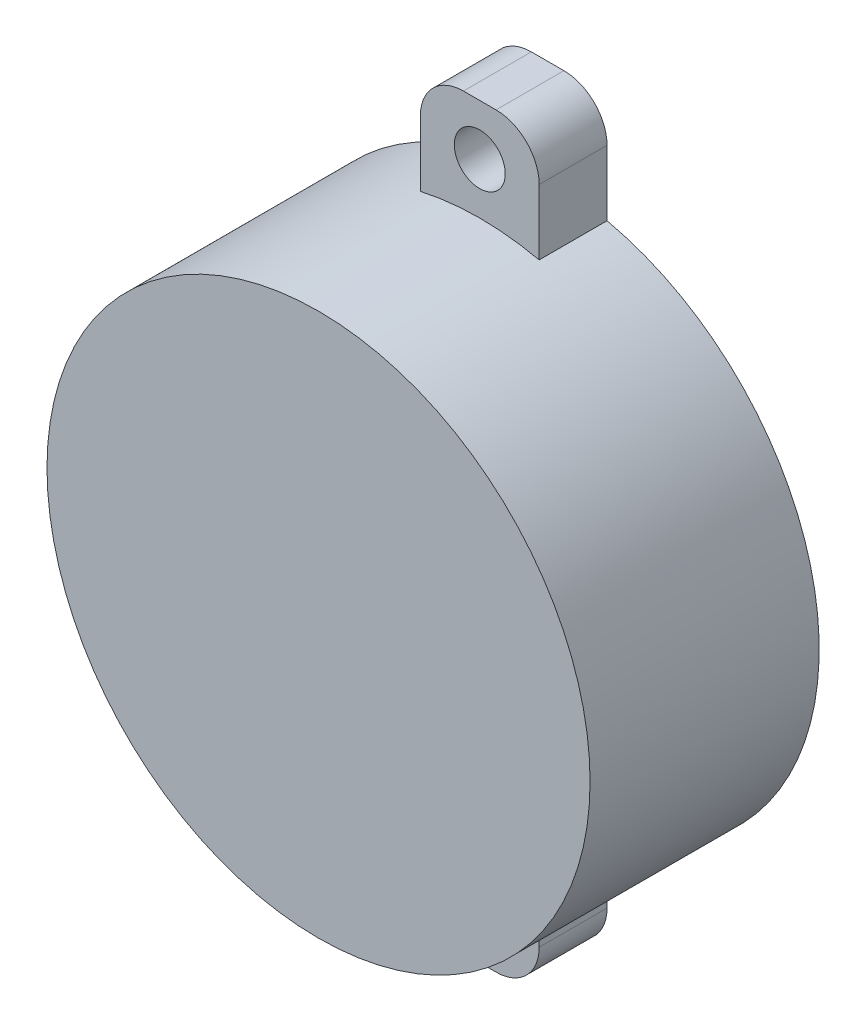
ISO-10303-21;
HEADER;
FILE_DESCRIPTION(('STEP AP214'),'2;1');
FILE_NAME('part.step','',(''),(''),'','','');
FILE_SCHEMA(('AUTOMOTIVE_DESIGN { 1 0 10303 214 1 1 1 1 }'));
ENDSEC;
DATA;
#1=APPLICATION_CONTEXT('core data for automotive mechanical design processes');
#2=APPLICATION_PROTOCOL_DEFINITION('international standard','automotive_design',2000,#1);
#3=PRODUCT_CONTEXT('',#1,'mechanical');
#4=PRODUCT('Part','Part','',(#3));
#5=PRODUCT_RELATED_PRODUCT_CATEGORY('part','',(#4));
#6=PRODUCT_DEFINITION_FORMATION('','',#4);
#7=PRODUCT_DEFINITION_CONTEXT('part definition',#1,'design');
#8=PRODUCT_DEFINITION('design','',#6,#7);
#9=PRODUCT_DEFINITION_SHAPE('','',#8);
#10=(LENGTH_UNIT() NAMED_UNIT(*) SI_UNIT(.MILLI.,.METRE.));
#11=(NAMED_UNIT(*) PLANE_ANGLE_UNIT() SI_UNIT($,.RADIAN.));
#12=(NAMED_UNIT(*) SI_UNIT($,.STERADIAN.) SOLID_ANGLE_UNIT());
#13=UNCERTAINTY_MEASURE_WITH_UNIT(LENGTH_MEASURE(1.E-05),#10,'distance_accuracy_value','');
#14=(GEOMETRIC_REPRESENTATION_CONTEXT(3) GLOBAL_UNCERTAINTY_ASSIGNED_CONTEXT((#13)) GLOBAL_UNIT_ASSIGNED_CONTEXT((#10,
#11,#12)) REPRESENTATION_CONTEXT('',''));
#15=CARTESIAN_POINT('',(0.,0.,0.));
#16=DIRECTION('',(0.,0.,1.));
#17=DIRECTION('',(1.,0.,0.));
#18=AXIS2_PLACEMENT_3D('',#15,#16,#17);
#19=CARTESIAN_POINT('',(0.,0.,0.));
#20=DIRECTION('',(0.,0.,1.));
#21=DIRECTION('',(1.,0.,0.));
#22=AXIS2_PLACEMENT_3D('',#19,#20,#21);
#23=PLANE('',#22);
#24=DIRECTION('',(1.,0.,0.));
#25=VECTOR('',#24,1.);
#26=CARTESIAN_POINT('',(3.5,22.,0.));
#27=LINE('',#26,#25);
#28=CARTESIAN_POINT('',(-0.959999999999997,22.,0.));
#29=VERTEX_POINT('',#28);
#30=CARTESIAN_POINT('',(0.960000000000003,22.,0.));
#31=VERTEX_POINT('',#30);
#32=EDGE_CURVE('E166',#29,#31,#27,.T.);
#33=ORIENTED_EDGE('',*,*,#32,.T.);
#34=CARTESIAN_POINT('',(0.960000000000003,19.46,0.));
#35=DIRECTION('',(0.,0.,1.));
#36=DIRECTION('',(1.,0.,0.));
#37=AXIS2_PLACEMENT_3D('',#34,#35,#36);
#38=CIRCLE('',#37,2.54);
#39=CARTESIAN_POINT('',(3.5,19.46,0.));
#40=VERTEX_POINT('',#39);
#41=EDGE_CURVE('E201',#31,#40,#38,.F.);
#42=ORIENTED_EDGE('',*,*,#41,.T.);
#43=DIRECTION('',(0.,-1.,0.));
#44=VECTOR('',#43,1.);
#45=CARTESIAN_POINT('',(3.5,22.,0.));
#46=LINE('',#45,#44);
#47=CARTESIAN_POINT('',(3.5,15.612494995996,0.));
#48=VERTEX_POINT('',#47);
#49=EDGE_CURVE('E141',#40,#48,#46,.T.);
#50=ORIENTED_EDGE('',*,*,#49,.T.);
#51=CARTESIAN_POINT('',(0.,0.,0.));
#52=DIRECTION('',(0.,0.,1.));
#53=DIRECTION('',(1.,0.,0.));
#54=AXIS2_PLACEMENT_3D('',#51,#52,#53);
#55=CIRCLE('',#54,16.);
#56=CARTESIAN_POINT('',(3.5,-15.612494995996,0.));
#57=VERTEX_POINT('',#56);
#58=EDGE_CURVE('E134',#57,#48,#55,.T.);
#59=ORIENTED_EDGE('',*,*,#58,.F.);
#60=CARTESIAN_POINT('',(3.5,-19.46,0.));
#61=VERTEX_POINT('',#60);
#62=EDGE_CURVE('E139',#57,#61,#46,.T.);
#63=ORIENTED_EDGE('',*,*,#62,.T.);
#64=CARTESIAN_POINT('',(0.959999999999998,-19.46,0.));
#65=DIRECTION('',(0.,0.,1.));
#66=DIRECTION('',(1.,0.,0.));
#67=AXIS2_PLACEMENT_3D('',#64,#65,#66);
#68=CIRCLE('',#67,2.54);
#69=CARTESIAN_POINT('',(0.959999999999998,-22.,0.));
#70=VERTEX_POINT('',#69);
#71=EDGE_CURVE('E197',#61,#70,#68,.F.);
#72=ORIENTED_EDGE('',*,*,#71,.T.);
#73=DIRECTION('',(-1.,0.,0.));
#74=VECTOR('',#73,1.);
#75=CARTESIAN_POINT('',(3.5,-22.,0.));
#76=LINE('',#75,#74);
#77=CARTESIAN_POINT('',(-0.960000000000003,-22.,0.));
#78=VERTEX_POINT('',#77);
#79=EDGE_CURVE('E168',#70,#78,#76,.T.);
#80=ORIENTED_EDGE('',*,*,#79,.T.);
#81=CARTESIAN_POINT('',(-0.960000000000003,-19.46,0.));
#82=DIRECTION('',(0.,0.,1.));
#83=DIRECTION('',(1.,0.,0.));
#84=AXIS2_PLACEMENT_3D('',#81,#82,#83);
#85=CIRCLE('',#84,2.54);
#86=CARTESIAN_POINT('',(-3.5,-19.46,0.));
#87=VERTEX_POINT('',#86);
#88=EDGE_CURVE('E194',#78,#87,#85,.F.);
#89=ORIENTED_EDGE('',*,*,#88,.T.);
#90=DIRECTION('',(0.,1.,0.));
#91=VECTOR('',#90,1.);
#92=CARTESIAN_POINT('',(-3.5,22.,0.));
#93=LINE('',#92,#91);
#94=CARTESIAN_POINT('',(-3.5,-15.612494995996,0.));
#95=VERTEX_POINT('',#94);
#96=EDGE_CURVE('E169',#87,#95,#93,.T.);
#97=ORIENTED_EDGE('',*,*,#96,.T.);
#98=CARTESIAN_POINT('',(-3.5,15.612494995996,0.));
#99=VERTEX_POINT('',#98);
#100=EDGE_CURVE('E146',#99,#95,#55,.T.);
#101=ORIENTED_EDGE('',*,*,#100,.F.);
#102=CARTESIAN_POINT('',(-3.5,19.46,0.));
#103=VERTEX_POINT('',#102);
#104=EDGE_CURVE('E223',#99,#103,#93,.T.);
#105=ORIENTED_EDGE('',*,*,#104,.T.);
#106=CARTESIAN_POINT('',(-0.959999999999997,19.46,0.));
#107=DIRECTION('',(0.,0.,1.));
#108=DIRECTION('',(1.,0.,0.));
#109=AXIS2_PLACEMENT_3D('',#106,#107,#108);
#110=CIRCLE('',#109,2.54);
#111=EDGE_CURVE('E199',#103,#29,#110,.F.);
#112=ORIENTED_EDGE('',*,*,#111,.T.);
#113=EDGE_LOOP('',(#33,#42,#50,#59,#63,#72,#80,#89,#97,#101,#105,#112));
#114=FACE_BOUND('',#113,.T.);
#115=CARTESIAN_POINT('',(0.,-19.,0.));
#116=DIRECTION('',(0.,0.,-1.));
#117=DIRECTION('',(-1.,0.,0.));
#118=AXIS2_PLACEMENT_3D('',#115,#116,#117);
#119=CIRCLE('',#118,1.5);
#120=CARTESIAN_POINT('',(-1.5,-19.,0.));
#121=VERTEX_POINT('',#120);
#122=EDGE_CURVE('E224',#121,#121,#119,.T.);
#123=ORIENTED_EDGE('',*,*,#122,.F.);
#124=EDGE_LOOP('',(#123));
#125=FACE_BOUND('',#124,.T.);
#126=CARTESIAN_POINT('',(0.,19.,0.));
#127=DIRECTION('',(0.,0.,1.));
#128=DIRECTION('',(-1.,0.,0.));
#129=AXIS2_PLACEMENT_3D('',#126,#127,#128);
#130=CIRCLE('',#129,1.5);
#131=CARTESIAN_POINT('',(-1.5,19.,0.));
#132=VERTEX_POINT('',#131);
#133=EDGE_CURVE('E235',#132,#132,#130,.T.);
#134=ORIENTED_EDGE('',*,*,#133,.T.);
#135=EDGE_LOOP('',(#134));
#136=FACE_BOUND('',#135,.T.);
#137=ADVANCED_FACE('F38',(#114,#125,#136),#23,.F.);
#138=CARTESIAN_POINT('',(0.,0.,4.));
#139=DIRECTION('',(0.,0.,-1.));
#140=DIRECTION('',(-1.,0.,0.));
#141=AXIS2_PLACEMENT_3D('',#138,#139,#140);
#142=PLANE('',#141);
#143=DIRECTION('',(0.,-1.,0.));
#144=VECTOR('',#143,1.);
#145=CARTESIAN_POINT('',(3.5,22.,4.));
#146=LINE('',#145,#144);
#147=CARTESIAN_POINT('',(3.5,19.46,4.));
#148=VERTEX_POINT('',#147);
#149=CARTESIAN_POINT('',(3.5,15.612494995996,4.));
#150=VERTEX_POINT('',#149);
#151=EDGE_CURVE('E244',#148,#150,#146,.T.);
#152=ORIENTED_EDGE('',*,*,#151,.F.);
#153=CARTESIAN_POINT('',(0.960000000000003,19.46,4.));
#154=DIRECTION('',(0.,0.,-1.));
#155=DIRECTION('',(-1.,0.,0.));
#156=AXIS2_PLACEMENT_3D('',#153,#154,#155);
#157=CIRCLE('',#156,2.54);
#158=CARTESIAN_POINT('',(0.960000000000003,22.,4.));
#159=VERTEX_POINT('',#158);
#160=EDGE_CURVE('E207',#148,#159,#157,.F.);
#161=ORIENTED_EDGE('',*,*,#160,.T.);
#162=DIRECTION('',(1.,0.,0.));
#163=VECTOR('',#162,1.);
#164=CARTESIAN_POINT('',(3.5,22.,4.));
#165=LINE('',#164,#163);
#166=CARTESIAN_POINT('',(-0.959999999999997,22.,4.));
#167=VERTEX_POINT('',#166);
#168=EDGE_CURVE('E240',#167,#159,#165,.T.);
#169=ORIENTED_EDGE('',*,*,#168,.F.);
#170=CARTESIAN_POINT('',(-0.959999999999997,19.46,4.));
#171=DIRECTION('',(0.,0.,-1.));
#172=DIRECTION('',(-1.,0.,0.));
#173=AXIS2_PLACEMENT_3D('',#170,#171,#172);
#174=CIRCLE('',#173,2.54);
#175=CARTESIAN_POINT('',(-3.5,19.46,4.));
#176=VERTEX_POINT('',#175);
#177=EDGE_CURVE('E205',#167,#176,#174,.F.);
#178=ORIENTED_EDGE('',*,*,#177,.T.);
#179=DIRECTION('',(0.,1.,0.));
#180=VECTOR('',#179,1.);
#181=CARTESIAN_POINT('',(-3.5,22.,4.));
#182=LINE('',#181,#180);
#183=CARTESIAN_POINT('',(-3.5,15.612494995996,4.));
#184=VERTEX_POINT('',#183);
#185=EDGE_CURVE('E175',#184,#176,#182,.T.);
#186=ORIENTED_EDGE('',*,*,#185,.F.);
#187=CARTESIAN_POINT('',(0.,0.,4.));
#188=DIRECTION('',(0.,0.,-1.));
#189=DIRECTION('',(-1.,0.,0.));
#190=AXIS2_PLACEMENT_3D('',#187,#188,#189);
#191=CIRCLE('',#190,16.);
#192=EDGE_CURVE('E188',#184,#150,#191,.T.);
#193=ORIENTED_EDGE('',*,*,#192,.T.);
#194=EDGE_LOOP('',(#152,#161,#169,#178,#186,#193));
#195=FACE_BOUND('',#194,.T.);
#196=CARTESIAN_POINT('',(0.,19.,4.));
#197=DIRECTION('',(0.,0.,-1.));
#198=DIRECTION('',(-1.,0.,0.));
#199=AXIS2_PLACEMENT_3D('',#196,#197,#198);
#200=CIRCLE('',#199,1.5);
#201=CARTESIAN_POINT('',(-1.5,19.,4.));
#202=VERTEX_POINT('',#201);
#203=EDGE_CURVE('E42',#202,#202,#200,.F.);
#204=ORIENTED_EDGE('',*,*,#203,.F.);
#205=EDGE_LOOP('',(#204));
#206=FACE_BOUND('',#205,.T.);
#207=ADVANCED_FACE('F274',(#195,#206),#142,.F.);
#208=CARTESIAN_POINT('',(0.,0.,13.5));
#209=DIRECTION('',(0.,0.,-1.));
#210=DIRECTION('',(-1.,0.,0.));
#211=AXIS2_PLACEMENT_3D('',#208,#209,#210);
#212=CYLINDRICAL_SURFACE('',#211,16.);
#213=ORIENTED_EDGE('',*,*,#192,.F.);
#214=DIRECTION('',(0.,0.,-1.));
#215=VECTOR('',#214,1.);
#216=CARTESIAN_POINT('',(-3.5,15.612494995996,13.5));
#217=LINE('',#216,#215);
#218=EDGE_CURVE('E147',#184,#99,#217,.T.);
#219=ORIENTED_EDGE('',*,*,#218,.T.);
#220=ORIENTED_EDGE('',*,*,#100,.T.);
#221=DIRECTION('',(0.,0.,-1.));
#222=VECTOR('',#221,1.);
#223=CARTESIAN_POINT('',(-3.5,-15.612494995996,13.5));
#224=LINE('',#223,#222);
#225=CARTESIAN_POINT('',(-3.5,-15.612494995996,4.));
#226=VERTEX_POINT('',#225);
#227=EDGE_CURVE('E159',#95,#226,#224,.F.);
#228=ORIENTED_EDGE('',*,*,#227,.T.);
#229=CARTESIAN_POINT('',(3.5,-15.612494995996,4.));
#230=VERTEX_POINT('',#229);
#231=EDGE_CURVE('E155',#230,#226,#191,.T.);
#232=ORIENTED_EDGE('',*,*,#231,.F.);
#233=DIRECTION('',(0.,0.,-1.));
#234=VECTOR('',#233,1.);
#235=CARTESIAN_POINT('',(3.5,-15.612494995996,13.5));
#236=LINE('',#235,#234);
#237=EDGE_CURVE('E150',#230,#57,#236,.T.);
#238=ORIENTED_EDGE('',*,*,#237,.T.);
#239=ORIENTED_EDGE('',*,*,#58,.T.);
#240=DIRECTION('',(0.,0.,-1.));
#241=VECTOR('',#240,1.);
#242=CARTESIAN_POINT('',(3.5,15.612494995996,13.5));
#243=LINE('',#242,#241);
#244=EDGE_CURVE('E160',#48,#150,#243,.F.);
#245=ORIENTED_EDGE('',*,*,#244,.T.);
#246=EDGE_LOOP('',(#213,#219,#220,#228,#232,#238,#239,#245));
#247=FACE_BOUND('',#246,.T.);
#248=CARTESIAN_POINT('',(0.,0.,13.5));
#249=DIRECTION('',(0.,0.,1.));
#250=DIRECTION('',(1.,0.,0.));
#251=AXIS2_PLACEMENT_3D('',#248,#249,#250);
#252=CIRCLE('',#251,16.);
#253=CARTESIAN_POINT('',(16.,0.,13.5));
#254=VERTEX_POINT('',#253);
#255=EDGE_CURVE('E182',#254,#254,#252,.T.);
#256=ORIENTED_EDGE('',*,*,#255,.F.);
#257=EDGE_LOOP('',(#256));
#258=FACE_BOUND('',#257,.T.);
#259=ADVANCED_FACE('F151',(#247,#258),#212,.T.);
#260=CARTESIAN_POINT('',(0.,0.,13.5));
#261=DIRECTION('',(0.,0.,1.));
#262=DIRECTION('',(1.,0.,0.));
#263=AXIS2_PLACEMENT_3D('',#260,#261,#262);
#264=PLANE('',#263);
#265=ORIENTED_EDGE('',*,*,#255,.T.);
#266=EDGE_LOOP('',(#265));
#267=FACE_BOUND('',#266,.T.);
#268=ADVANCED_FACE('F284',(#267),#264,.T.);
#269=CARTESIAN_POINT('',(3.5,-22.,4.));
#270=DIRECTION('',(0.,-1.,0.));
#271=DIRECTION('',(0.,0.,-1.));
#272=AXIS2_PLACEMENT_3D('',#269,#270,#271);
#273=PLANE('',#272);
#274=ORIENTED_EDGE('',*,*,#79,.F.);
#275=DIRECTION('',(0.,0.,-1.));
#276=VECTOR('',#275,1.);
#277=CARTESIAN_POINT('',(0.959999999999998,-22.,4.));
#278=LINE('',#277,#276);
#279=CARTESIAN_POINT('',(0.959999999999998,-22.,4.));
#280=VERTEX_POINT('',#279);
#281=EDGE_CURVE('E216',#70,#280,#278,.F.);
#282=ORIENTED_EDGE('',*,*,#281,.T.);
#283=DIRECTION('',(-1.,0.,0.));
#284=VECTOR('',#283,1.);
#285=CARTESIAN_POINT('',(3.5,-22.,4.));
#286=LINE('',#285,#284);
#287=CARTESIAN_POINT('',(-0.960000000000003,-22.,4.));
#288=VERTEX_POINT('',#287);
#289=EDGE_CURVE('E176',#280,#288,#286,.T.);
#290=ORIENTED_EDGE('',*,*,#289,.T.);
#291=DIRECTION('',(0.,0.,-1.));
#292=VECTOR('',#291,1.);
#293=CARTESIAN_POINT('',(-0.960000000000003,-22.,4.));
#294=LINE('',#293,#292);
#295=EDGE_CURVE('E213',#288,#78,#294,.T.);
#296=ORIENTED_EDGE('',*,*,#295,.T.);
#297=EDGE_LOOP('',(#274,#282,#290,#296));
#298=FACE_BOUND('',#297,.T.);
#299=ADVANCED_FACE('F258',(#298),#273,.T.);
#300=CARTESIAN_POINT('',(0.,-19.,4.));
#301=DIRECTION('',(0.,0.,-1.));
#302=DIRECTION('',(-1.,0.,0.));
#303=AXIS2_PLACEMENT_3D('',#300,#301,#302);
#304=CIRCLE('',#303,1.5);
#305=CARTESIAN_POINT('',(-1.5,-19.,4.));
#306=VERTEX_POINT('',#305);
#307=EDGE_CURVE('E220',#306,#306,#304,.T.);
#308=ORIENTED_EDGE('',*,*,#307,.T.);
#309=EDGE_LOOP('',(#308));
#310=FACE_BOUND('',#309,.T.);
#311=ORIENTED_EDGE('',*,*,#289,.F.);
#312=CARTESIAN_POINT('',(0.959999999999998,-19.46,4.));
#313=DIRECTION('',(0.,0.,-1.));
#314=DIRECTION('',(-1.,0.,0.));
#315=AXIS2_PLACEMENT_3D('',#312,#313,#314);
#316=CIRCLE('',#315,2.54);
#317=CARTESIAN_POINT('',(3.5,-19.46,4.));
#318=VERTEX_POINT('',#317);
#319=EDGE_CURVE('E48',#280,#318,#316,.F.);
#320=ORIENTED_EDGE('',*,*,#319,.T.);
#321=EDGE_CURVE('E243',#230,#318,#146,.T.);
#322=ORIENTED_EDGE('',*,*,#321,.F.);
#323=ORIENTED_EDGE('',*,*,#231,.T.);
#324=CARTESIAN_POINT('',(-3.5,-19.46,4.));
#325=VERTEX_POINT('',#324);
#326=EDGE_CURVE('E238',#325,#226,#182,.T.);
#327=ORIENTED_EDGE('',*,*,#326,.F.);
#328=CARTESIAN_POINT('',(-0.960000000000003,-19.46,4.));
#329=DIRECTION('',(0.,0.,-1.));
#330=DIRECTION('',(-1.,0.,0.));
#331=AXIS2_PLACEMENT_3D('',#328,#329,#330);
#332=CIRCLE('',#331,2.54);
#333=EDGE_CURVE('E63',#325,#288,#332,.F.);
#334=ORIENTED_EDGE('',*,*,#333,.T.);
#335=EDGE_LOOP('',(#311,#320,#322,#323,#327,#334));
#336=FACE_BOUND('',#335,.T.);
#337=ADVANCED_FACE('F253',(#310,#336),#142,.F.);
#338=CARTESIAN_POINT('',(3.5,22.,4.));
#339=DIRECTION('',(1.,0.,0.));
#340=DIRECTION('',(0.,1.,0.));
#341=AXIS2_PLACEMENT_3D('',#338,#339,#340);
#342=PLANE('',#341);
#343=ORIENTED_EDGE('',*,*,#321,.T.);
#344=DIRECTION('',(0.,0.,-1.));
#345=VECTOR('',#344,1.);
#346=CARTESIAN_POINT('',(3.5,-19.46,4.));
#347=LINE('',#346,#345);
#348=EDGE_CURVE('E165',#318,#61,#347,.T.);
#349=ORIENTED_EDGE('',*,*,#348,.T.);
#350=ORIENTED_EDGE('',*,*,#62,.F.);
#351=ORIENTED_EDGE('',*,*,#237,.F.);
#352=EDGE_LOOP('',(#343,#349,#350,#351));
#353=FACE_BOUND('',#352,.T.);
#354=ADVANCED_FACE('F163',(#353),#342,.T.);
#355=CARTESIAN_POINT('',(-3.5,22.,4.));
#356=DIRECTION('',(-1.,0.,0.));
#357=DIRECTION('',(0.,-1.,0.));
#358=AXIS2_PLACEMENT_3D('',#355,#356,#357);
#359=PLANE('',#358);
#360=ORIENTED_EDGE('',*,*,#96,.F.);
#361=DIRECTION('',(0.,0.,-1.));
#362=VECTOR('',#361,1.);
#363=CARTESIAN_POINT('',(-3.5,-19.46,4.));
#364=LINE('',#363,#362);
#365=EDGE_CURVE('E11',#87,#325,#364,.F.);
#366=ORIENTED_EDGE('',*,*,#365,.T.);
#367=ORIENTED_EDGE('',*,*,#326,.T.);
#368=ORIENTED_EDGE('',*,*,#227,.F.);
#369=EDGE_LOOP('',(#360,#366,#367,#368));
#370=FACE_BOUND('',#369,.T.);
#371=ADVANCED_FACE('F252',(#370),#359,.T.);
#372=ORIENTED_EDGE('',*,*,#185,.T.);
#373=DIRECTION('',(0.,0.,-1.));
#374=VECTOR('',#373,1.);
#375=CARTESIAN_POINT('',(-3.5,19.46,4.));
#376=LINE('',#375,#374);
#377=EDGE_CURVE('E209',#176,#103,#376,.T.);
#378=ORIENTED_EDGE('',*,*,#377,.T.);
#379=ORIENTED_EDGE('',*,*,#104,.F.);
#380=ORIENTED_EDGE('',*,*,#218,.F.);
#381=EDGE_LOOP('',(#372,#378,#379,#380));
#382=FACE_BOUND('',#381,.T.);
#383=ADVANCED_FACE('F310',(#382),#359,.T.);
#384=ORIENTED_EDGE('',*,*,#49,.F.);
#385=DIRECTION('',(0.,0.,-1.));
#386=VECTOR('',#385,1.);
#387=CARTESIAN_POINT('',(3.5,19.46,4.));
#388=LINE('',#387,#386);
#389=EDGE_CURVE('E203',#40,#148,#388,.F.);
#390=ORIENTED_EDGE('',*,*,#389,.T.);
#391=ORIENTED_EDGE('',*,*,#151,.T.);
#392=ORIENTED_EDGE('',*,*,#244,.F.);
#393=EDGE_LOOP('',(#384,#390,#391,#392));
#394=FACE_BOUND('',#393,.T.);
#395=ADVANCED_FACE('F293',(#394),#342,.T.);
#396=CARTESIAN_POINT('',(3.5,22.,4.));
#397=DIRECTION('',(0.,1.,0.));
#398=DIRECTION('',(0.,0.,1.));
#399=AXIS2_PLACEMENT_3D('',#396,#397,#398);
#400=PLANE('',#399);
#401=ORIENTED_EDGE('',*,*,#168,.T.);
#402=DIRECTION('',(0.,0.,-1.));
#403=VECTOR('',#402,1.);
#404=CARTESIAN_POINT('',(0.960000000000003,22.,4.));
#405=LINE('',#404,#403);
#406=EDGE_CURVE('E191',#159,#31,#405,.T.);
#407=ORIENTED_EDGE('',*,*,#406,.T.);
#408=ORIENTED_EDGE('',*,*,#32,.F.);
#409=DIRECTION('',(0.,0.,-1.));
#410=VECTOR('',#409,1.);
#411=CARTESIAN_POINT('',(-0.959999999999997,22.,4.));
#412=LINE('',#411,#410);
#413=EDGE_CURVE('E189',#29,#167,#412,.F.);
#414=ORIENTED_EDGE('',*,*,#413,.T.);
#415=EDGE_LOOP('',(#401,#407,#408,#414));
#416=FACE_BOUND('',#415,.T.);
#417=ADVANCED_FACE('F288',(#416),#400,.T.);
#418=CARTESIAN_POINT('',(0.960000000000003,19.46,4.));
#419=DIRECTION('',(0.,0.,-1.));
#420=DIRECTION('',(-1.,0.,0.));
#421=AXIS2_PLACEMENT_3D('',#418,#419,#420);
#422=CYLINDRICAL_SURFACE('',#421,2.54);
#423=ORIENTED_EDGE('',*,*,#160,.F.);
#424=ORIENTED_EDGE('',*,*,#389,.F.);
#425=ORIENTED_EDGE('',*,*,#41,.F.);
#426=ORIENTED_EDGE('',*,*,#406,.F.);
#427=EDGE_LOOP('',(#423,#424,#425,#426));
#428=FACE_BOUND('',#427,.T.);
#429=ADVANCED_FACE('F270',(#428),#422,.T.);
#430=CARTESIAN_POINT('',(-0.959999999999997,19.46,4.));
#431=DIRECTION('',(0.,0.,-1.));
#432=DIRECTION('',(-1.,0.,0.));
#433=AXIS2_PLACEMENT_3D('',#430,#431,#432);
#434=CYLINDRICAL_SURFACE('',#433,2.54);
#435=ORIENTED_EDGE('',*,*,#177,.F.);
#436=ORIENTED_EDGE('',*,*,#413,.F.);
#437=ORIENTED_EDGE('',*,*,#111,.F.);
#438=ORIENTED_EDGE('',*,*,#377,.F.);
#439=EDGE_LOOP('',(#435,#436,#437,#438));
#440=FACE_BOUND('',#439,.T.);
#441=ADVANCED_FACE('F264',(#440),#434,.T.);
#442=CARTESIAN_POINT('',(0.959999999999998,-19.46,4.));
#443=DIRECTION('',(0.,0.,-1.));
#444=DIRECTION('',(-1.,0.,0.));
#445=AXIS2_PLACEMENT_3D('',#442,#443,#444);
#446=CYLINDRICAL_SURFACE('',#445,2.54);
#447=ORIENTED_EDGE('',*,*,#319,.F.);
#448=ORIENTED_EDGE('',*,*,#281,.F.);
#449=ORIENTED_EDGE('',*,*,#71,.F.);
#450=ORIENTED_EDGE('',*,*,#348,.F.);
#451=EDGE_LOOP('',(#447,#448,#449,#450));
#452=FACE_BOUND('',#451,.T.);
#453=ADVANCED_FACE('F262',(#452),#446,.T.);
#454=CARTESIAN_POINT('',(-0.960000000000003,-19.46,4.));
#455=DIRECTION('',(0.,0.,-1.));
#456=DIRECTION('',(-1.,0.,0.));
#457=AXIS2_PLACEMENT_3D('',#454,#455,#456);
#458=CYLINDRICAL_SURFACE('',#457,2.54);
#459=ORIENTED_EDGE('',*,*,#333,.F.);
#460=ORIENTED_EDGE('',*,*,#365,.F.);
#461=ORIENTED_EDGE('',*,*,#88,.F.);
#462=ORIENTED_EDGE('',*,*,#295,.F.);
#463=EDGE_LOOP('',(#459,#460,#461,#462));
#464=FACE_BOUND('',#463,.T.);
#465=ADVANCED_FACE('F40',(#464),#458,.T.);
#466=CARTESIAN_POINT('',(0.,-19.,13.5));
#467=DIRECTION('',(0.,0.,-1.));
#468=DIRECTION('',(-1.,0.,0.));
#469=AXIS2_PLACEMENT_3D('',#466,#467,#468);
#470=CYLINDRICAL_SURFACE('',#469,1.5);
#471=ORIENTED_EDGE('',*,*,#122,.T.);
#472=EDGE_LOOP('',(#471));
#473=FACE_BOUND('',#472,.T.);
#474=ORIENTED_EDGE('',*,*,#307,.F.);
#475=EDGE_LOOP('',(#474));
#476=FACE_BOUND('',#475,.T.);
#477=ADVANCED_FACE('F269',(#473,#476),#470,.F.);
#478=CARTESIAN_POINT('',(0.,19.,13.5));
#479=DIRECTION('',(0.,0.,-1.));
#480=DIRECTION('',(-1.,0.,0.));
#481=AXIS2_PLACEMENT_3D('',#478,#479,#480);
#482=CYLINDRICAL_SURFACE('',#481,1.5);
#483=ORIENTED_EDGE('',*,*,#133,.F.);
#484=EDGE_LOOP('',(#483));
#485=FACE_BOUND('',#484,.T.);
#486=ORIENTED_EDGE('',*,*,#203,.T.);
#487=EDGE_LOOP('',(#486));
#488=FACE_BOUND('',#487,.T.);
#489=ADVANCED_FACE('F329',(#485,#488),#482,.F.);
#490=CLOSED_SHELL('',(#137,#207,#259,#268,#299,#337,#354,#371,#383,#395,#417,#429,#441,#453,
#465,#477,#489));
#491=MANIFOLD_SOLID_BREP('B2',#490);
#492=ADVANCED_BREP_SHAPE_REPRESENTATION('',(#18,#491),#14);
#493=SHAPE_DEFINITION_REPRESENTATION(#9,#492);
ENDSEC;
END-ISO-10303-21;
